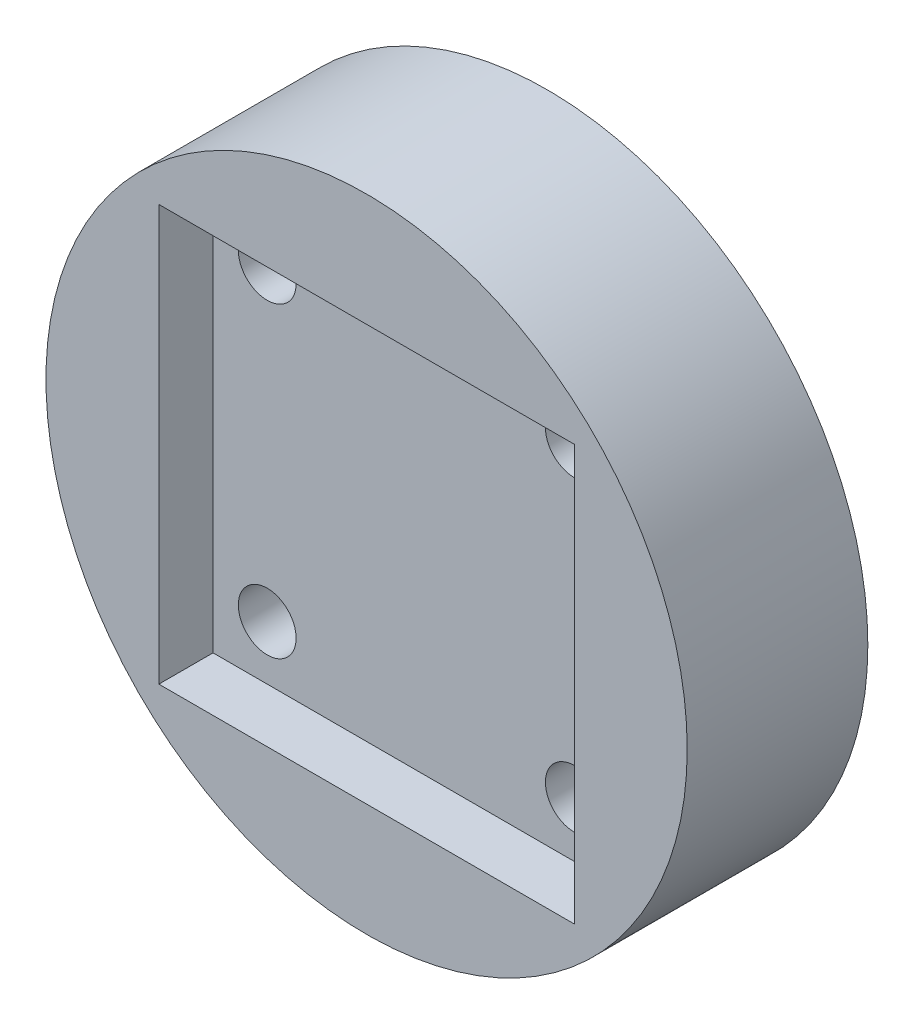
ISO-10303-21;
HEADER;
FILE_DESCRIPTION(('STEP AP214'),'2;1');
FILE_NAME('part.step','',(''),(''),'','','');
FILE_SCHEMA(('AUTOMOTIVE_DESIGN { 1 0 10303 214 1 1 1 1 }'));
ENDSEC;
DATA;
#1=APPLICATION_CONTEXT('core data for automotive mechanical design processes');
#2=APPLICATION_PROTOCOL_DEFINITION('international standard','automotive_design',2000,#1);
#3=PRODUCT_CONTEXT('',#1,'mechanical');
#4=PRODUCT('Part','Part','',(#3));
#5=PRODUCT_RELATED_PRODUCT_CATEGORY('part','',(#4));
#6=PRODUCT_DEFINITION_FORMATION('','',#4);
#7=PRODUCT_DEFINITION_CONTEXT('part definition',#1,'design');
#8=PRODUCT_DEFINITION('design','',#6,#7);
#9=PRODUCT_DEFINITION_SHAPE('','',#8);
#10=(LENGTH_UNIT() NAMED_UNIT(*) SI_UNIT(.MILLI.,.METRE.));
#11=(NAMED_UNIT(*) PLANE_ANGLE_UNIT() SI_UNIT($,.RADIAN.));
#12=(NAMED_UNIT(*) SI_UNIT($,.STERADIAN.) SOLID_ANGLE_UNIT());
#13=UNCERTAINTY_MEASURE_WITH_UNIT(LENGTH_MEASURE(1.E-05),#10,'distance_accuracy_value','');
#14=(GEOMETRIC_REPRESENTATION_CONTEXT(3) GLOBAL_UNCERTAINTY_ASSIGNED_CONTEXT((#13)) GLOBAL_UNIT_ASSIGNED_CONTEXT((#10,
#11,#12)) REPRESENTATION_CONTEXT('',''));
#15=CARTESIAN_POINT('',(0.,0.,0.));
#16=DIRECTION('',(0.,0.,1.));
#17=DIRECTION('',(1.,0.,0.));
#18=AXIS2_PLACEMENT_3D('',#15,#16,#17);
#19=CARTESIAN_POINT('',(0.,0.,10.));
#20=DIRECTION('',(0.,0.,-1.));
#21=DIRECTION('',(-1.,0.,0.));
#22=AXIS2_PLACEMENT_3D('',#19,#20,#21);
#23=CYLINDRICAL_SURFACE('',#22,17.75);
#24=CARTESIAN_POINT('',(0.,0.,10.));
#25=DIRECTION('',(0.,0.,1.));
#26=DIRECTION('',(1.,0.,0.));
#27=AXIS2_PLACEMENT_3D('',#24,#25,#26);
#28=CIRCLE('',#27,17.75);
#29=CARTESIAN_POINT('',(17.75,0.,10.));
#30=VERTEX_POINT('',#29);
#31=EDGE_CURVE('E11',#30,#30,#28,.T.);
#32=ORIENTED_EDGE('',*,*,#31,.F.);
#33=EDGE_LOOP('',(#32));
#34=FACE_BOUND('',#33,.T.);
#35=CARTESIAN_POINT('',(0.,0.,0.));
#36=DIRECTION('',(0.,0.,1.));
#37=DIRECTION('',(1.,0.,0.));
#38=AXIS2_PLACEMENT_3D('',#35,#36,#37);
#39=CIRCLE('',#38,17.75);
#40=CARTESIAN_POINT('',(17.75,0.,0.));
#41=VERTEX_POINT('',#40);
#42=EDGE_CURVE('E51',#41,#41,#39,.T.);
#43=ORIENTED_EDGE('',*,*,#42,.T.);
#44=EDGE_LOOP('',(#43));
#45=FACE_BOUND('',#44,.T.);
#46=ADVANCED_FACE('F43',(#34,#45),#23,.T.);
#47=CARTESIAN_POINT('',(0.,0.,10.));
#48=DIRECTION('',(0.,0.,1.));
#49=DIRECTION('',(1.,0.,0.));
#50=AXIS2_PLACEMENT_3D('',#47,#48,#49);
#51=PLANE('',#50);
#52=DIRECTION('',(1.,0.,0.));
#53=VECTOR('',#52,1.);
#54=CARTESIAN_POINT('',(0.,-11.5,10.));
#55=LINE('',#54,#53);
#56=CARTESIAN_POINT('',(-11.5,-11.5,10.));
#57=VERTEX_POINT('',#56);
#58=CARTESIAN_POINT('',(11.5,-11.5,10.));
#59=VERTEX_POINT('',#58);
#60=EDGE_CURVE('E59',#57,#59,#55,.T.);
#61=ORIENTED_EDGE('',*,*,#60,.F.);
#62=DIRECTION('',(0.,-1.,0.));
#63=VECTOR('',#62,1.);
#64=CARTESIAN_POINT('',(-11.5,0.,10.));
#65=LINE('',#64,#63);
#66=CARTESIAN_POINT('',(-11.5,11.5,10.));
#67=VERTEX_POINT('',#66);
#68=EDGE_CURVE('E110',#67,#57,#65,.T.);
#69=ORIENTED_EDGE('',*,*,#68,.F.);
#70=DIRECTION('',(1.,0.,0.));
#71=VECTOR('',#70,1.);
#72=CARTESIAN_POINT('',(0.,11.5,10.));
#73=LINE('',#72,#71);
#74=CARTESIAN_POINT('',(11.5,11.5,10.));
#75=VERTEX_POINT('',#74);
#76=EDGE_CURVE('E117',#67,#75,#73,.T.);
#77=ORIENTED_EDGE('',*,*,#76,.T.);
#78=DIRECTION('',(0.,-1.,0.));
#79=VECTOR('',#78,1.);
#80=CARTESIAN_POINT('',(11.5,0.,10.));
#81=LINE('',#80,#79);
#82=EDGE_CURVE('E102',#75,#59,#81,.T.);
#83=ORIENTED_EDGE('',*,*,#82,.T.);
#84=EDGE_LOOP('',(#61,#69,#77,#83));
#85=FACE_BOUND('',#84,.T.);
#86=ORIENTED_EDGE('',*,*,#31,.T.);
#87=EDGE_LOOP('',(#86));
#88=FACE_BOUND('',#87,.T.);
#89=ADVANCED_FACE('F162',(#85,#88),#51,.T.);
#90=CARTESIAN_POINT('',(0.,0.,0.));
#91=DIRECTION('',(0.,0.,1.));
#92=DIRECTION('',(1.,0.,0.));
#93=AXIS2_PLACEMENT_3D('',#90,#91,#92);
#94=PLANE('',#93);
#95=CARTESIAN_POINT('',(-8.5,-8.50000000000001,0.));
#96=DIRECTION('',(0.,0.,1.));
#97=DIRECTION('',(1.,0.,0.));
#98=AXIS2_PLACEMENT_3D('',#95,#96,#97);
#99=CIRCLE('',#98,1.6);
#100=CARTESIAN_POINT('',(-6.9,-8.50000000000001,0.));
#101=VERTEX_POINT('',#100);
#102=EDGE_CURVE('E244',#101,#101,#99,.T.);
#103=ORIENTED_EDGE('',*,*,#102,.T.);
#104=EDGE_LOOP('',(#103));
#105=FACE_BOUND('',#104,.T.);
#106=CARTESIAN_POINT('',(-8.50000000000001,8.5,0.));
#107=DIRECTION('',(0.,0.,1.));
#108=DIRECTION('',(1.,0.,0.));
#109=AXIS2_PLACEMENT_3D('',#106,#107,#108);
#110=CIRCLE('',#109,1.6);
#111=CARTESIAN_POINT('',(-6.90000000000001,8.5,0.));
#112=VERTEX_POINT('',#111);
#113=EDGE_CURVE('E245',#112,#112,#110,.T.);
#114=ORIENTED_EDGE('',*,*,#113,.T.);
#115=EDGE_LOOP('',(#114));
#116=FACE_BOUND('',#115,.T.);
#117=CARTESIAN_POINT('',(8.5,8.50000000000001,0.));
#118=DIRECTION('',(0.,0.,1.));
#119=DIRECTION('',(1.,0.,0.));
#120=AXIS2_PLACEMENT_3D('',#117,#118,#119);
#121=CIRCLE('',#120,1.6);
#122=CARTESIAN_POINT('',(10.1,8.50000000000001,0.));
#123=VERTEX_POINT('',#122);
#124=EDGE_CURVE('E248',#123,#123,#121,.T.);
#125=ORIENTED_EDGE('',*,*,#124,.T.);
#126=EDGE_LOOP('',(#125));
#127=FACE_BOUND('',#126,.T.);
#128=CARTESIAN_POINT('',(8.50000000000001,-8.5,0.));
#129=DIRECTION('',(0.,0.,1.));
#130=DIRECTION('',(1.,0.,0.));
#131=AXIS2_PLACEMENT_3D('',#128,#129,#130);
#132=CIRCLE('',#131,1.6);
#133=CARTESIAN_POINT('',(10.1,-8.5,0.));
#134=VERTEX_POINT('',#133);
#135=EDGE_CURVE('E129',#134,#134,#132,.T.);
#136=ORIENTED_EDGE('',*,*,#135,.T.);
#137=EDGE_LOOP('',(#136));
#138=FACE_BOUND('',#137,.T.);
#139=ORIENTED_EDGE('',*,*,#42,.F.);
#140=EDGE_LOOP('',(#139));
#141=FACE_BOUND('',#140,.T.);
#142=ADVANCED_FACE('F167',(#105,#116,#127,#138,#141),#94,.F.);
#143=CARTESIAN_POINT('',(0.,-11.5,7.));
#144=DIRECTION('',(0.,-1.,0.));
#145=DIRECTION('',(0.,0.,-1.));
#146=AXIS2_PLACEMENT_3D('',#143,#144,#145);
#147=PLANE('',#146);
#148=ORIENTED_EDGE('',*,*,#60,.T.);
#149=DIRECTION('',(0.,0.,1.));
#150=VECTOR('',#149,1.);
#151=CARTESIAN_POINT('',(11.5,-11.5,7.));
#152=LINE('',#151,#150);
#153=CARTESIAN_POINT('',(11.5,-11.5,7.));
#154=VERTEX_POINT('',#153);
#155=EDGE_CURVE('E104',#154,#59,#152,.T.);
#156=ORIENTED_EDGE('',*,*,#155,.F.);
#157=DIRECTION('',(1.,0.,0.));
#158=VECTOR('',#157,1.);
#159=CARTESIAN_POINT('',(0.,-11.5,7.));
#160=LINE('',#159,#158);
#161=CARTESIAN_POINT('',(-11.5,-11.5,7.));
#162=VERTEX_POINT('',#161);
#163=EDGE_CURVE('E108',#162,#154,#160,.T.);
#164=ORIENTED_EDGE('',*,*,#163,.F.);
#165=DIRECTION('',(0.,0.,1.));
#166=VECTOR('',#165,1.);
#167=CARTESIAN_POINT('',(-11.5,-11.5,7.));
#168=LINE('',#167,#166);
#169=EDGE_CURVE('E67',#162,#57,#168,.T.);
#170=ORIENTED_EDGE('',*,*,#169,.T.);
#171=EDGE_LOOP('',(#148,#156,#164,#170));
#172=FACE_BOUND('',#171,.T.);
#173=ADVANCED_FACE('F175',(#172),#147,.F.);
#174=CARTESIAN_POINT('',(-11.5,0.,7.));
#175=DIRECTION('',(-1.,0.,0.));
#176=DIRECTION('',(0.,0.,1.));
#177=AXIS2_PLACEMENT_3D('',#174,#175,#176);
#178=PLANE('',#177);
#179=ORIENTED_EDGE('',*,*,#68,.T.);
#180=ORIENTED_EDGE('',*,*,#169,.F.);
#181=DIRECTION('',(0.,-1.,0.));
#182=VECTOR('',#181,1.);
#183=CARTESIAN_POINT('',(-11.5,0.,7.));
#184=LINE('',#183,#182);
#185=CARTESIAN_POINT('',(-11.5,11.5,7.));
#186=VERTEX_POINT('',#185);
#187=EDGE_CURVE('E98',#186,#162,#184,.T.);
#188=ORIENTED_EDGE('',*,*,#187,.F.);
#189=DIRECTION('',(0.,0.,1.));
#190=VECTOR('',#189,1.);
#191=CARTESIAN_POINT('',(-11.5,11.5,7.));
#192=LINE('',#191,#190);
#193=EDGE_CURVE('E95',#186,#67,#192,.T.);
#194=ORIENTED_EDGE('',*,*,#193,.T.);
#195=EDGE_LOOP('',(#179,#180,#188,#194));
#196=FACE_BOUND('',#195,.T.);
#197=ADVANCED_FACE('F181',(#196),#178,.F.);
#198=CARTESIAN_POINT('',(0.,11.5,7.));
#199=DIRECTION('',(0.,-1.,0.));
#200=DIRECTION('',(0.,0.,-1.));
#201=AXIS2_PLACEMENT_3D('',#198,#199,#200);
#202=PLANE('',#201);
#203=ORIENTED_EDGE('',*,*,#76,.F.);
#204=ORIENTED_EDGE('',*,*,#193,.F.);
#205=DIRECTION('',(1.,0.,0.));
#206=VECTOR('',#205,1.);
#207=CARTESIAN_POINT('',(0.,11.5,7.));
#208=LINE('',#207,#206);
#209=CARTESIAN_POINT('',(11.5,11.5,7.));
#210=VERTEX_POINT('',#209);
#211=EDGE_CURVE('E90',#186,#210,#208,.T.);
#212=ORIENTED_EDGE('',*,*,#211,.T.);
#213=DIRECTION('',(0.,0.,1.));
#214=VECTOR('',#213,1.);
#215=CARTESIAN_POINT('',(11.5,11.5,7.));
#216=LINE('',#215,#214);
#217=EDGE_CURVE('E93',#210,#75,#216,.T.);
#218=ORIENTED_EDGE('',*,*,#217,.T.);
#219=EDGE_LOOP('',(#203,#204,#212,#218));
#220=FACE_BOUND('',#219,.T.);
#221=ADVANCED_FACE('F92',(#220),#202,.T.);
#222=CARTESIAN_POINT('',(11.5,0.,7.));
#223=DIRECTION('',(-1.,0.,0.));
#224=DIRECTION('',(0.,0.,1.));
#225=AXIS2_PLACEMENT_3D('',#222,#223,#224);
#226=PLANE('',#225);
#227=ORIENTED_EDGE('',*,*,#82,.F.);
#228=ORIENTED_EDGE('',*,*,#217,.F.);
#229=DIRECTION('',(0.,-1.,0.));
#230=VECTOR('',#229,1.);
#231=CARTESIAN_POINT('',(11.5,0.,7.));
#232=LINE('',#231,#230);
#233=EDGE_CURVE('E86',#210,#154,#232,.T.);
#234=ORIENTED_EDGE('',*,*,#233,.T.);
#235=ORIENTED_EDGE('',*,*,#155,.T.);
#236=EDGE_LOOP('',(#227,#228,#234,#235));
#237=FACE_BOUND('',#236,.T.);
#238=ADVANCED_FACE('F100',(#237),#226,.T.);
#239=CARTESIAN_POINT('',(0.,0.,7.));
#240=DIRECTION('',(0.,0.,-1.));
#241=DIRECTION('',(-1.,0.,0.));
#242=AXIS2_PLACEMENT_3D('',#239,#240,#241);
#243=PLANE('',#242);
#244=CARTESIAN_POINT('',(-8.5,-8.50000000000001,7.));
#245=DIRECTION('',(0.,0.,-1.));
#246=DIRECTION('',(-1.,0.,0.));
#247=AXIS2_PLACEMENT_3D('',#244,#245,#246);
#248=CIRCLE('',#247,1.6);
#249=CARTESIAN_POINT('',(-10.1,-8.50000000000001,7.));
#250=VERTEX_POINT('',#249);
#251=EDGE_CURVE('E46',#250,#250,#248,.F.);
#252=ORIENTED_EDGE('',*,*,#251,.F.);
#253=EDGE_LOOP('',(#252));
#254=FACE_BOUND('',#253,.T.);
#255=CARTESIAN_POINT('',(-8.50000000000001,8.5,7.));
#256=DIRECTION('',(0.,0.,-1.));
#257=DIRECTION('',(-1.,0.,0.));
#258=AXIS2_PLACEMENT_3D('',#255,#256,#257);
#259=CIRCLE('',#258,1.6);
#260=CARTESIAN_POINT('',(-10.1,8.5,7.));
#261=VERTEX_POINT('',#260);
#262=EDGE_CURVE('E131',#261,#261,#259,.F.);
#263=ORIENTED_EDGE('',*,*,#262,.F.);
#264=EDGE_LOOP('',(#263));
#265=FACE_BOUND('',#264,.T.);
#266=CARTESIAN_POINT('',(8.5,8.50000000000001,7.));
#267=DIRECTION('',(0.,0.,-1.));
#268=DIRECTION('',(-1.,0.,0.));
#269=AXIS2_PLACEMENT_3D('',#266,#267,#268);
#270=CIRCLE('',#269,1.6);
#271=CARTESIAN_POINT('',(6.9,8.50000000000001,7.));
#272=VERTEX_POINT('',#271);
#273=EDGE_CURVE('E128',#272,#272,#270,.F.);
#274=ORIENTED_EDGE('',*,*,#273,.F.);
#275=EDGE_LOOP('',(#274));
#276=FACE_BOUND('',#275,.T.);
#277=CARTESIAN_POINT('',(8.50000000000001,-8.5,7.));
#278=DIRECTION('',(0.,0.,-1.));
#279=DIRECTION('',(-1.,0.,0.));
#280=AXIS2_PLACEMENT_3D('',#277,#278,#279);
#281=CIRCLE('',#280,1.6);
#282=CARTESIAN_POINT('',(6.90000000000001,-8.5,7.));
#283=VERTEX_POINT('',#282);
#284=EDGE_CURVE('E125',#283,#283,#281,.F.);
#285=ORIENTED_EDGE('',*,*,#284,.F.);
#286=EDGE_LOOP('',(#285));
#287=FACE_BOUND('',#286,.T.);
#288=ORIENTED_EDGE('',*,*,#163,.T.);
#289=ORIENTED_EDGE('',*,*,#233,.F.);
#290=ORIENTED_EDGE('',*,*,#211,.F.);
#291=ORIENTED_EDGE('',*,*,#187,.T.);
#292=EDGE_LOOP('',(#288,#289,#290,#291));
#293=FACE_BOUND('',#292,.T.);
#294=ADVANCED_FACE('F107',(#254,#265,#276,#287,#293),#243,.F.);
#295=CARTESIAN_POINT('',(8.50000000000001,-8.5,10.));
#296=DIRECTION('',(0.,0.,-1.));
#297=DIRECTION('',(-1.,0.,0.));
#298=AXIS2_PLACEMENT_3D('',#295,#296,#297);
#299=CYLINDRICAL_SURFACE('',#298,1.6);
#300=ORIENTED_EDGE('',*,*,#135,.F.);
#301=EDGE_LOOP('',(#300));
#302=FACE_BOUND('',#301,.T.);
#303=ORIENTED_EDGE('',*,*,#284,.T.);
#304=EDGE_LOOP('',(#303));
#305=FACE_BOUND('',#304,.T.);
#306=ADVANCED_FACE('F142',(#302,#305),#299,.F.);
#307=CARTESIAN_POINT('',(8.5,8.50000000000001,10.));
#308=DIRECTION('',(0.,0.,-1.));
#309=DIRECTION('',(-1.,0.,0.));
#310=AXIS2_PLACEMENT_3D('',#307,#308,#309);
#311=CYLINDRICAL_SURFACE('',#310,1.6);
#312=ORIENTED_EDGE('',*,*,#124,.F.);
#313=EDGE_LOOP('',(#312));
#314=FACE_BOUND('',#313,.T.);
#315=ORIENTED_EDGE('',*,*,#273,.T.);
#316=EDGE_LOOP('',(#315));
#317=FACE_BOUND('',#316,.T.);
#318=ADVANCED_FACE('F150',(#314,#317),#311,.F.);
#319=CARTESIAN_POINT('',(-8.50000000000001,8.5,10.));
#320=DIRECTION('',(0.,0.,-1.));
#321=DIRECTION('',(-1.,0.,0.));
#322=AXIS2_PLACEMENT_3D('',#319,#320,#321);
#323=CYLINDRICAL_SURFACE('',#322,1.6);
#324=ORIENTED_EDGE('',*,*,#113,.F.);
#325=EDGE_LOOP('',(#324));
#326=FACE_BOUND('',#325,.T.);
#327=ORIENTED_EDGE('',*,*,#262,.T.);
#328=EDGE_LOOP('',(#327));
#329=FACE_BOUND('',#328,.T.);
#330=ADVANCED_FACE('F156',(#326,#329),#323,.F.);
#331=CARTESIAN_POINT('',(-8.5,-8.50000000000001,10.));
#332=DIRECTION('',(0.,0.,-1.));
#333=DIRECTION('',(-1.,0.,0.));
#334=AXIS2_PLACEMENT_3D('',#331,#332,#333);
#335=CYLINDRICAL_SURFACE('',#334,1.6);
#336=ORIENTED_EDGE('',*,*,#102,.F.);
#337=EDGE_LOOP('',(#336));
#338=FACE_BOUND('',#337,.T.);
#339=ORIENTED_EDGE('',*,*,#251,.T.);
#340=EDGE_LOOP('',(#339));
#341=FACE_BOUND('',#340,.T.);
#342=ADVANCED_FACE('F138',(#338,#341),#335,.F.);
#343=CLOSED_SHELL('',(#46,#89,#142,#173,#197,#221,#238,#294,#306,#318,#330,#342));
#344=MANIFOLD_SOLID_BREP('B2',#343);
#345=ADVANCED_BREP_SHAPE_REPRESENTATION('',(#18,#344),#14);
#346=SHAPE_DEFINITION_REPRESENTATION(#9,#345);
ENDSEC;
END-ISO-10303-21;
